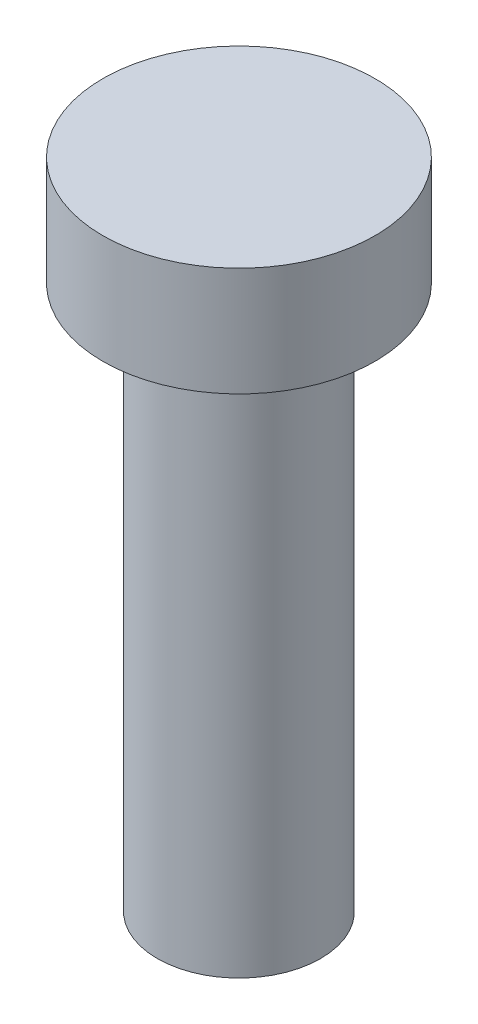
ISO-10303-21;
HEADER;
FILE_DESCRIPTION(('STEP AP214'),'2;1');
FILE_NAME('part.step','',(''),(''),'','','');
FILE_SCHEMA(('AUTOMOTIVE_DESIGN { 1 0 10303 214 1 1 1 1 }'));
ENDSEC;
DATA;
#1=APPLICATION_CONTEXT('core data for automotive mechanical design processes');
#2=APPLICATION_PROTOCOL_DEFINITION('international standard','automotive_design',2000,#1);
#3=PRODUCT_CONTEXT('',#1,'mechanical');
#4=PRODUCT('Part','Part','',(#3));
#5=PRODUCT_RELATED_PRODUCT_CATEGORY('part','',(#4));
#6=PRODUCT_DEFINITION_FORMATION('','',#4);
#7=PRODUCT_DEFINITION_CONTEXT('part definition',#1,'design');
#8=PRODUCT_DEFINITION('design','',#6,#7);
#9=PRODUCT_DEFINITION_SHAPE('','',#8);
#10=(LENGTH_UNIT() NAMED_UNIT(*) SI_UNIT(.MILLI.,.METRE.));
#11=(NAMED_UNIT(*) PLANE_ANGLE_UNIT() SI_UNIT($,.RADIAN.));
#12=(NAMED_UNIT(*) SI_UNIT($,.STERADIAN.) SOLID_ANGLE_UNIT());
#13=UNCERTAINTY_MEASURE_WITH_UNIT(LENGTH_MEASURE(1.E-05),#10,'distance_accuracy_value','');
#14=(GEOMETRIC_REPRESENTATION_CONTEXT(3) GLOBAL_UNCERTAINTY_ASSIGNED_CONTEXT((#13)) GLOBAL_UNIT_ASSIGNED_CONTEXT((#10,
#11,#12)) REPRESENTATION_CONTEXT('',''));
#15=CARTESIAN_POINT('',(0.,0.,0.));
#16=DIRECTION('',(0.,0.,1.));
#17=DIRECTION('',(1.,0.,0.));
#18=AXIS2_PLACEMENT_3D('',#15,#16,#17);
#19=CARTESIAN_POINT('',(0.,0.,0.));
#20=DIRECTION('',(0.,1.,0.));
#21=DIRECTION('',(0.,0.,1.));
#22=AXIS2_PLACEMENT_3D('',#19,#20,#21);
#23=PLANE('',#22);
#24=CARTESIAN_POINT('',(0.,0.,0.));
#25=DIRECTION('',(0.,1.,0.));
#26=DIRECTION('',(0.,0.,1.));
#27=AXIS2_PLACEMENT_3D('',#24,#25,#26);
#28=CIRCLE('',#27,2.25);
#29=CARTESIAN_POINT('',(0.,0.,2.25));
#30=VERTEX_POINT('',#29);
#31=EDGE_CURVE('E10',#30,#30,#28,.T.);
#32=ORIENTED_EDGE('',*,*,#31,.F.);
#33=EDGE_LOOP('',(#32));
#34=FACE_BOUND('',#33,.T.);
#35=ADVANCED_FACE('F30',(#34),#23,.F.);
#36=CARTESIAN_POINT('',(0.,18.,0.));
#37=DIRECTION('',(0.,1.,0.));
#38=DIRECTION('',(0.,0.,1.));
#39=AXIS2_PLACEMENT_3D('',#36,#37,#38);
#40=CYLINDRICAL_SURFACE('',#39,2.25);
#41=CARTESIAN_POINT('',(0.,15.,0.));
#42=DIRECTION('',(0.,1.,0.));
#43=DIRECTION('',(0.,0.,1.));
#44=AXIS2_PLACEMENT_3D('',#41,#42,#43);
#45=CIRCLE('',#44,2.25);
#46=CARTESIAN_POINT('',(0.,15.,2.25));
#47=VERTEX_POINT('',#46);
#48=EDGE_CURVE('E36',#47,#47,#45,.T.);
#49=ORIENTED_EDGE('',*,*,#48,.F.);
#50=EDGE_LOOP('',(#49));
#51=FACE_BOUND('',#50,.T.);
#52=ORIENTED_EDGE('',*,*,#31,.T.);
#53=EDGE_LOOP('',(#52));
#54=FACE_BOUND('',#53,.T.);
#55=ADVANCED_FACE('F60',(#51,#54),#40,.T.);
#56=CARTESIAN_POINT('',(2.25,15.,0.));
#57=DIRECTION('',(0.,1.,0.));
#58=DIRECTION('',(0.,0.,1.));
#59=AXIS2_PLACEMENT_3D('',#56,#57,#58);
#60=PLANE('',#59);
#61=CARTESIAN_POINT('',(0.,15.,0.));
#62=DIRECTION('',(0.,1.,0.));
#63=DIRECTION('',(0.,0.,1.));
#64=AXIS2_PLACEMENT_3D('',#61,#62,#63);
#65=CIRCLE('',#64,3.75);
#66=CARTESIAN_POINT('',(0.,15.,3.75));
#67=VERTEX_POINT('',#66);
#68=EDGE_CURVE('E40',#67,#67,#65,.T.);
#69=ORIENTED_EDGE('',*,*,#68,.F.);
#70=EDGE_LOOP('',(#69));
#71=FACE_BOUND('',#70,.T.);
#72=ORIENTED_EDGE('',*,*,#48,.T.);
#73=EDGE_LOOP('',(#72));
#74=FACE_BOUND('',#73,.T.);
#75=ADVANCED_FACE('F55',(#71,#74),#60,.F.);
#76=CARTESIAN_POINT('',(0.,18.,0.));
#77=DIRECTION('',(0.,1.,0.));
#78=DIRECTION('',(0.,0.,1.));
#79=AXIS2_PLACEMENT_3D('',#76,#77,#78);
#80=CYLINDRICAL_SURFACE('',#79,3.75);
#81=CARTESIAN_POINT('',(0.,18.,0.));
#82=DIRECTION('',(0.,1.,0.));
#83=DIRECTION('',(0.,0.,1.));
#84=AXIS2_PLACEMENT_3D('',#81,#82,#83);
#85=CIRCLE('',#84,3.75);
#86=CARTESIAN_POINT('',(0.,18.,3.75));
#87=VERTEX_POINT('',#86);
#88=EDGE_CURVE('E44',#87,#87,#85,.T.);
#89=ORIENTED_EDGE('',*,*,#88,.F.);
#90=EDGE_LOOP('',(#89));
#91=FACE_BOUND('',#90,.T.);
#92=ORIENTED_EDGE('',*,*,#68,.T.);
#93=EDGE_LOOP('',(#92));
#94=FACE_BOUND('',#93,.T.);
#95=ADVANCED_FACE('F52',(#91,#94),#80,.T.);
#96=CARTESIAN_POINT('',(3.75,18.,0.));
#97=DIRECTION('',(0.,-1.,0.));
#98=DIRECTION('',(0.,0.,-1.));
#99=AXIS2_PLACEMENT_3D('',#96,#97,#98);
#100=PLANE('',#99);
#101=ORIENTED_EDGE('',*,*,#88,.T.);
#102=EDGE_LOOP('',(#101));
#103=FACE_BOUND('',#102,.T.);
#104=ADVANCED_FACE('F50',(#103),#100,.F.);
#105=CLOSED_SHELL('',(#35,#55,#75,#95,#104));
#106=MANIFOLD_SOLID_BREP('B2',#105);
#107=ADVANCED_BREP_SHAPE_REPRESENTATION('',(#18,#106),#14);
#108=SHAPE_DEFINITION_REPRESENTATION(#9,#107);
ENDSEC;
END-ISO-10303-21;
